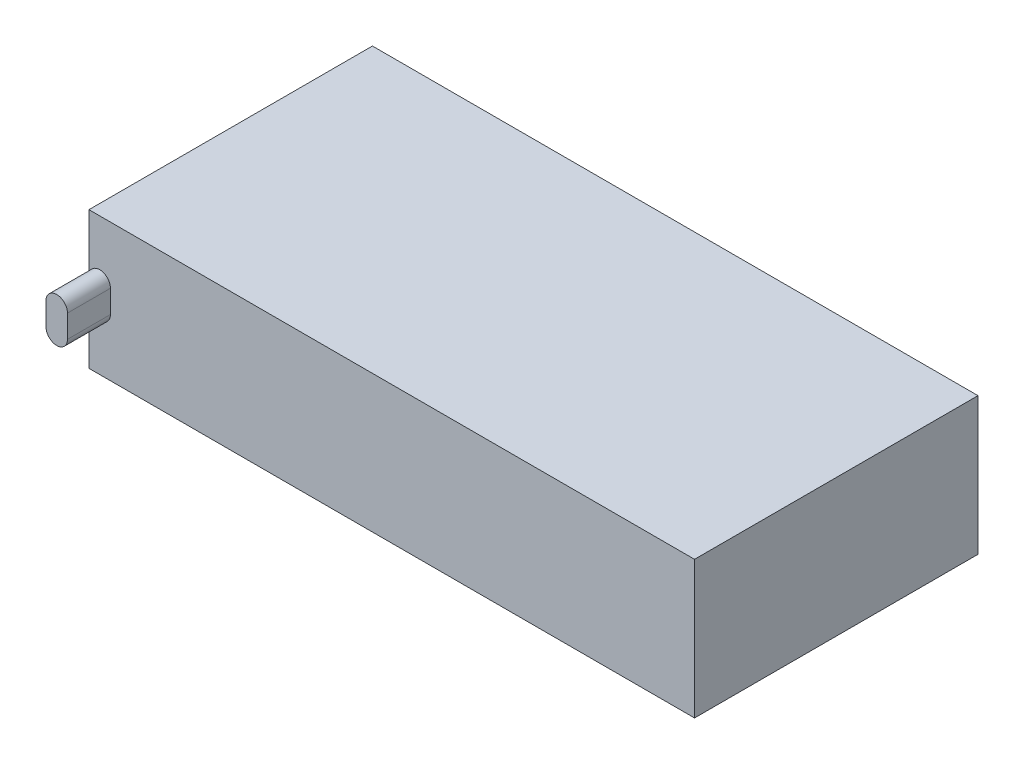
ISO-10303-21;
HEADER;
FILE_DESCRIPTION(('STEP AP214'),'2;1');
FILE_NAME('part.step','',(''),(''),'','','');
FILE_SCHEMA(('AUTOMOTIVE_DESIGN { 1 0 10303 214 1 1 1 1 }'));
ENDSEC;
DATA;
#1=APPLICATION_CONTEXT('core data for automotive mechanical design processes');
#2=APPLICATION_PROTOCOL_DEFINITION('international standard','automotive_design',2000,#1);
#3=PRODUCT_CONTEXT('',#1,'mechanical');
#4=PRODUCT('Part','Part','',(#3));
#5=PRODUCT_RELATED_PRODUCT_CATEGORY('part','',(#4));
#6=PRODUCT_DEFINITION_FORMATION('','',#4);
#7=PRODUCT_DEFINITION_CONTEXT('part definition',#1,'design');
#8=PRODUCT_DEFINITION('design','',#6,#7);
#9=PRODUCT_DEFINITION_SHAPE('','',#8);
#10=(LENGTH_UNIT() NAMED_UNIT(*) SI_UNIT(.MILLI.,.METRE.));
#11=(NAMED_UNIT(*) PLANE_ANGLE_UNIT() SI_UNIT($,.RADIAN.));
#12=(NAMED_UNIT(*) SI_UNIT($,.STERADIAN.) SOLID_ANGLE_UNIT());
#13=UNCERTAINTY_MEASURE_WITH_UNIT(LENGTH_MEASURE(1.E-05),#10,'distance_accuracy_value','');
#14=(GEOMETRIC_REPRESENTATION_CONTEXT(3) GLOBAL_UNCERTAINTY_ASSIGNED_CONTEXT((#13)) GLOBAL_UNIT_ASSIGNED_CONTEXT((#10,
#11,#12)) REPRESENTATION_CONTEXT('',''));
#15=CARTESIAN_POINT('',(0.,0.,0.));
#16=DIRECTION('',(0.,0.,1.));
#17=DIRECTION('',(1.,0.,0.));
#18=AXIS2_PLACEMENT_3D('',#15,#16,#17);
#19=CARTESIAN_POINT('',(35.814,0.,0.));
#20=DIRECTION('',(0.,0.,-1.));
#21=DIRECTION('',(0.,1.,0.));
#22=AXIS2_PLACEMENT_3D('',#19,#20,#21);
#23=PLANE('',#22);
#24=CARTESIAN_POINT('',(0.635,4.73647354458814,0.));
#25=DIRECTION('',(0.,0.,1.));
#26=DIRECTION('',(1.,0.,0.));
#27=AXIS2_PLACEMENT_3D('',#24,#25,#26);
#28=CIRCLE('',#27,0.634999999999999);
#29=CARTESIAN_POINT('',(1.27,4.73647354458814,0.));
#30=VERTEX_POINT('',#29);
#31=CARTESIAN_POINT('',(0.,4.73647354458814,0.));
#32=VERTEX_POINT('',#31);
#33=EDGE_CURVE('E50',#30,#32,#28,.T.);
#34=ORIENTED_EDGE('',*,*,#33,.F.);
#35=DIRECTION('',(0.,1.,0.));
#36=VECTOR('',#35,1.);
#37=CARTESIAN_POINT('',(1.27,4.73647354458814,0.));
#38=LINE('',#37,#36);
#39=CARTESIAN_POINT('',(1.27,3.39152645541186,0.));
#40=VERTEX_POINT('',#39);
#41=EDGE_CURVE('E119',#40,#30,#38,.T.);
#42=ORIENTED_EDGE('',*,*,#41,.F.);
#43=CARTESIAN_POINT('',(0.635,3.39152645541186,0.));
#44=DIRECTION('',(0.,0.,1.));
#45=DIRECTION('',(1.,0.,0.));
#46=AXIS2_PLACEMENT_3D('',#43,#44,#45);
#47=CIRCLE('',#46,0.634999999999999);
#48=CARTESIAN_POINT('',(0.,3.39152645541186,0.));
#49=VERTEX_POINT('',#48);
#50=EDGE_CURVE('E56',#49,#40,#47,.T.);
#51=ORIENTED_EDGE('',*,*,#50,.F.);
#52=DIRECTION('',(0.,-1.,0.));
#53=VECTOR('',#52,1.);
#54=CARTESIAN_POINT('',(0.,0.,0.));
#55=LINE('',#54,#53);
#56=CARTESIAN_POINT('',(0.,0.,0.));
#57=VERTEX_POINT('',#56);
#58=EDGE_CURVE('E122',#49,#57,#55,.T.);
#59=ORIENTED_EDGE('',*,*,#58,.T.);
#60=DIRECTION('',(-1.,0.,0.));
#61=VECTOR('',#60,1.);
#62=CARTESIAN_POINT('',(35.814,0.,0.));
#63=LINE('',#62,#61);
#64=CARTESIAN_POINT('',(35.814,0.,0.));
#65=VERTEX_POINT('',#64);
#66=EDGE_CURVE('E11',#65,#57,#63,.T.);
#67=ORIENTED_EDGE('',*,*,#66,.F.);
#68=DIRECTION('',(0.,-1.,0.));
#69=VECTOR('',#68,1.);
#70=CARTESIAN_POINT('',(35.814,0.,0.));
#71=LINE('',#70,#69);
#72=CARTESIAN_POINT('',(35.814,8.128,0.));
#73=VERTEX_POINT('',#72);
#74=EDGE_CURVE('E130',#73,#65,#71,.T.);
#75=ORIENTED_EDGE('',*,*,#74,.F.);
#76=DIRECTION('',(-1.,0.,0.));
#77=VECTOR('',#76,1.);
#78=CARTESIAN_POINT('',(35.814,8.128,0.));
#79=LINE('',#78,#77);
#80=CARTESIAN_POINT('',(0.,8.128,0.));
#81=VERTEX_POINT('',#80);
#82=EDGE_CURVE('E139',#73,#81,#79,.T.);
#83=ORIENTED_EDGE('',*,*,#82,.T.);
#84=EDGE_CURVE('E124',#81,#32,#55,.T.);
#85=ORIENTED_EDGE('',*,*,#84,.T.);
#86=EDGE_LOOP('',(#34,#42,#51,#59,#67,#75,#83,#85));
#87=FACE_BOUND('',#86,.T.);
#88=ADVANCED_FACE('F36',(#87),#23,.F.);
#89=CARTESIAN_POINT('',(35.814,0.,0.));
#90=DIRECTION('',(0.,1.,0.));
#91=DIRECTION('',(0.,0.,1.));
#92=AXIS2_PLACEMENT_3D('',#89,#90,#91);
#93=PLANE('',#92);
#94=DIRECTION('',(0.,0.,-1.));
#95=VECTOR('',#94,1.);
#96=CARTESIAN_POINT('',(0.,0.,0.));
#97=LINE('',#96,#95);
#98=CARTESIAN_POINT('',(0.,0.,-16.764));
#99=VERTEX_POINT('',#98);
#100=EDGE_CURVE('E141',#57,#99,#97,.T.);
#101=ORIENTED_EDGE('',*,*,#100,.T.);
#102=DIRECTION('',(-1.,0.,0.));
#103=VECTOR('',#102,1.);
#104=CARTESIAN_POINT('',(35.814,0.,-16.764));
#105=LINE('',#104,#103);
#106=CARTESIAN_POINT('',(35.814,0.,-16.764));
#107=VERTEX_POINT('',#106);
#108=EDGE_CURVE('E43',#107,#99,#105,.T.);
#109=ORIENTED_EDGE('',*,*,#108,.F.);
#110=DIRECTION('',(0.,0.,-1.));
#111=VECTOR('',#110,1.);
#112=CARTESIAN_POINT('',(35.814,0.,0.));
#113=LINE('',#112,#111);
#114=EDGE_CURVE('E133',#65,#107,#113,.T.);
#115=ORIENTED_EDGE('',*,*,#114,.F.);
#116=ORIENTED_EDGE('',*,*,#66,.T.);
#117=EDGE_LOOP('',(#101,#109,#115,#116));
#118=FACE_BOUND('',#117,.T.);
#119=ADVANCED_FACE('F168',(#118),#93,.F.);
#120=CARTESIAN_POINT('',(35.814,0.,-16.764));
#121=DIRECTION('',(0.,0.,1.));
#122=DIRECTION('',(0.,-1.,0.));
#123=AXIS2_PLACEMENT_3D('',#120,#121,#122);
#124=PLANE('',#123);
#125=DIRECTION('',(0.,1.,0.));
#126=VECTOR('',#125,1.);
#127=CARTESIAN_POINT('',(0.,0.,-16.764));
#128=LINE('',#127,#126);
#129=CARTESIAN_POINT('',(0.,8.128,-16.764));
#130=VERTEX_POINT('',#129);
#131=EDGE_CURVE('E143',#99,#130,#128,.T.);
#132=ORIENTED_EDGE('',*,*,#131,.T.);
#133=DIRECTION('',(-1.,0.,0.));
#134=VECTOR('',#133,1.);
#135=CARTESIAN_POINT('',(35.814,8.128,-16.764));
#136=LINE('',#135,#134);
#137=CARTESIAN_POINT('',(35.814,8.128,-16.764));
#138=VERTEX_POINT('',#137);
#139=EDGE_CURVE('E148',#138,#130,#136,.T.);
#140=ORIENTED_EDGE('',*,*,#139,.F.);
#141=DIRECTION('',(0.,1.,0.));
#142=VECTOR('',#141,1.);
#143=CARTESIAN_POINT('',(35.814,0.,-16.764));
#144=LINE('',#143,#142);
#145=EDGE_CURVE('E136',#107,#138,#144,.T.);
#146=ORIENTED_EDGE('',*,*,#145,.F.);
#147=ORIENTED_EDGE('',*,*,#108,.T.);
#148=EDGE_LOOP('',(#132,#140,#146,#147));
#149=FACE_BOUND('',#148,.T.);
#150=ADVANCED_FACE('F155',(#149),#124,.F.);
#151=CARTESIAN_POINT('',(35.814,8.128,0.));
#152=DIRECTION('',(0.,-1.,0.));
#153=DIRECTION('',(0.,0.,-1.));
#154=AXIS2_PLACEMENT_3D('',#151,#152,#153);
#155=PLANE('',#154);
#156=DIRECTION('',(0.,0.,1.));
#157=VECTOR('',#156,1.);
#158=CARTESIAN_POINT('',(0.,8.128,0.));
#159=LINE('',#158,#157);
#160=EDGE_CURVE('E134',#130,#81,#159,.T.);
#161=ORIENTED_EDGE('',*,*,#160,.T.);
#162=ORIENTED_EDGE('',*,*,#82,.F.);
#163=DIRECTION('',(0.,0.,1.));
#164=VECTOR('',#163,1.);
#165=CARTESIAN_POINT('',(35.814,8.128,0.));
#166=LINE('',#165,#164);
#167=EDGE_CURVE('E138',#138,#73,#166,.T.);
#168=ORIENTED_EDGE('',*,*,#167,.F.);
#169=ORIENTED_EDGE('',*,*,#139,.T.);
#170=EDGE_LOOP('',(#161,#162,#168,#169));
#171=FACE_BOUND('',#170,.T.);
#172=ADVANCED_FACE('F162',(#171),#155,.F.);
#173=CARTESIAN_POINT('',(35.814,0.,0.));
#174=DIRECTION('',(-1.,0.,0.));
#175=DIRECTION('',(0.,0.,1.));
#176=AXIS2_PLACEMENT_3D('',#173,#174,#175);
#177=PLANE('',#176);
#178=ORIENTED_EDGE('',*,*,#74,.T.);
#179=ORIENTED_EDGE('',*,*,#114,.T.);
#180=ORIENTED_EDGE('',*,*,#145,.T.);
#181=ORIENTED_EDGE('',*,*,#167,.T.);
#182=EDGE_LOOP('',(#178,#179,#180,#181));
#183=FACE_BOUND('',#182,.T.);
#184=ADVANCED_FACE('F167',(#183),#177,.F.);
#185=CARTESIAN_POINT('',(0.,0.,0.));
#186=DIRECTION('',(-1.,0.,0.));
#187=DIRECTION('',(0.,0.,1.));
#188=AXIS2_PLACEMENT_3D('',#185,#186,#187);
#189=PLANE('',#188);
#190=ORIENTED_EDGE('',*,*,#84,.F.);
#191=ORIENTED_EDGE('',*,*,#160,.F.);
#192=ORIENTED_EDGE('',*,*,#131,.F.);
#193=ORIENTED_EDGE('',*,*,#100,.F.);
#194=ORIENTED_EDGE('',*,*,#58,.F.);
#195=DIRECTION('',(0.,0.,-1.));
#196=VECTOR('',#195,1.);
#197=CARTESIAN_POINT('',(0.,3.39152645541186,2.54));
#198=LINE('',#197,#196);
#199=CARTESIAN_POINT('',(0.,3.39152645541186,2.54));
#200=VERTEX_POINT('',#199);
#201=EDGE_CURVE('E106',#200,#49,#198,.T.);
#202=ORIENTED_EDGE('',*,*,#201,.F.);
#203=DIRECTION('',(0.,-1.,0.));
#204=VECTOR('',#203,1.);
#205=CARTESIAN_POINT('',(0.,4.73647354458814,2.54));
#206=LINE('',#205,#204);
#207=CARTESIAN_POINT('',(0.,4.73647354458814,2.54));
#208=VERTEX_POINT('',#207);
#209=EDGE_CURVE('E99',#208,#200,#206,.T.);
#210=ORIENTED_EDGE('',*,*,#209,.F.);
#211=DIRECTION('',(0.,0.,-1.));
#212=VECTOR('',#211,1.);
#213=CARTESIAN_POINT('',(0.,4.73647354458814,2.54));
#214=LINE('',#213,#212);
#215=EDGE_CURVE('E104',#208,#32,#214,.T.);
#216=ORIENTED_EDGE('',*,*,#215,.T.);
#217=EDGE_LOOP('',(#190,#191,#192,#193,#194,#202,#210,#216));
#218=FACE_BOUND('',#217,.T.);
#219=ADVANCED_FACE('F102',(#218),#189,.T.);
#220=CARTESIAN_POINT('',(0.635,4.73647354458814,2.54));
#221=DIRECTION('',(0.,0.,-1.));
#222=DIRECTION('',(-1.,0.,0.));
#223=AXIS2_PLACEMENT_3D('',#220,#221,#222);
#224=CYLINDRICAL_SURFACE('',#223,0.634999999999999);
#225=ORIENTED_EDGE('',*,*,#33,.T.);
#226=ORIENTED_EDGE('',*,*,#215,.F.);
#227=CARTESIAN_POINT('',(0.635,4.73647354458814,2.54));
#228=DIRECTION('',(0.,0.,1.));
#229=DIRECTION('',(1.,0.,0.));
#230=AXIS2_PLACEMENT_3D('',#227,#228,#229);
#231=CIRCLE('',#230,0.634999999999999);
#232=CARTESIAN_POINT('',(1.27,4.73647354458814,2.54));
#233=VERTEX_POINT('',#232);
#234=EDGE_CURVE('E110',#233,#208,#231,.T.);
#235=ORIENTED_EDGE('',*,*,#234,.F.);
#236=DIRECTION('',(0.,0.,-1.));
#237=VECTOR('',#236,1.);
#238=CARTESIAN_POINT('',(1.27,4.73647354458814,2.54));
#239=LINE('',#238,#237);
#240=EDGE_CURVE('E275',#233,#30,#239,.T.);
#241=ORIENTED_EDGE('',*,*,#240,.T.);
#242=EDGE_LOOP('',(#225,#226,#235,#241));
#243=FACE_BOUND('',#242,.T.);
#244=ADVANCED_FACE('F121',(#243),#224,.T.);
#245=CARTESIAN_POINT('',(0.635,3.39152645541186,2.54));
#246=DIRECTION('',(0.,0.,-1.));
#247=DIRECTION('',(-1.,0.,0.));
#248=AXIS2_PLACEMENT_3D('',#245,#246,#247);
#249=CYLINDRICAL_SURFACE('',#248,0.634999999999999);
#250=ORIENTED_EDGE('',*,*,#50,.T.);
#251=DIRECTION('',(0.,0.,-1.));
#252=VECTOR('',#251,1.);
#253=CARTESIAN_POINT('',(1.27,3.39152645541186,2.54));
#254=LINE('',#253,#252);
#255=CARTESIAN_POINT('',(1.27,3.39152645541186,2.54));
#256=VERTEX_POINT('',#255);
#257=EDGE_CURVE('E126',#256,#40,#254,.T.);
#258=ORIENTED_EDGE('',*,*,#257,.F.);
#259=CARTESIAN_POINT('',(0.635,3.39152645541186,2.54));
#260=DIRECTION('',(0.,0.,1.));
#261=DIRECTION('',(1.,0.,0.));
#262=AXIS2_PLACEMENT_3D('',#259,#260,#261);
#263=CIRCLE('',#262,0.634999999999999);
#264=EDGE_CURVE('E109',#200,#256,#263,.T.);
#265=ORIENTED_EDGE('',*,*,#264,.F.);
#266=ORIENTED_EDGE('',*,*,#201,.T.);
#267=EDGE_LOOP('',(#250,#258,#265,#266));
#268=FACE_BOUND('',#267,.T.);
#269=ADVANCED_FACE('F184',(#268),#249,.T.);
#270=CARTESIAN_POINT('',(1.27,4.73647354458814,2.54));
#271=DIRECTION('',(-1.,0.,0.));
#272=DIRECTION('',(0.,0.,1.));
#273=AXIS2_PLACEMENT_3D('',#270,#271,#272);
#274=PLANE('',#273);
#275=ORIENTED_EDGE('',*,*,#41,.T.);
#276=ORIENTED_EDGE('',*,*,#240,.F.);
#277=DIRECTION('',(0.,1.,0.));
#278=VECTOR('',#277,1.);
#279=CARTESIAN_POINT('',(1.27,4.73647354458814,2.54));
#280=LINE('',#279,#278);
#281=EDGE_CURVE('E115',#256,#233,#280,.T.);
#282=ORIENTED_EDGE('',*,*,#281,.F.);
#283=ORIENTED_EDGE('',*,*,#257,.T.);
#284=EDGE_LOOP('',(#275,#276,#282,#283));
#285=FACE_BOUND('',#284,.T.);
#286=ADVANCED_FACE('F187',(#285),#274,.F.);
#287=CARTESIAN_POINT('',(0.635,4.73647354458814,2.54));
#288=DIRECTION('',(0.,0.,1.));
#289=DIRECTION('',(1.,0.,0.));
#290=AXIS2_PLACEMENT_3D('',#287,#288,#289);
#291=PLANE('',#290);
#292=ORIENTED_EDGE('',*,*,#234,.T.);
#293=ORIENTED_EDGE('',*,*,#209,.T.);
#294=ORIENTED_EDGE('',*,*,#264,.T.);
#295=ORIENTED_EDGE('',*,*,#281,.T.);
#296=EDGE_LOOP('',(#292,#293,#294,#295));
#297=FACE_BOUND('',#296,.T.);
#298=ADVANCED_FACE('F113',(#297),#291,.T.);
#299=CLOSED_SHELL('',(#88,#119,#150,#172,#184,#219,#244,#269,#286,#298));
#300=MANIFOLD_SOLID_BREP('B2',#299);
#301=ADVANCED_BREP_SHAPE_REPRESENTATION('',(#18,#300),#14);
#302=SHAPE_DEFINITION_REPRESENTATION(#9,#301);
ENDSEC;
END-ISO-10303-21;
